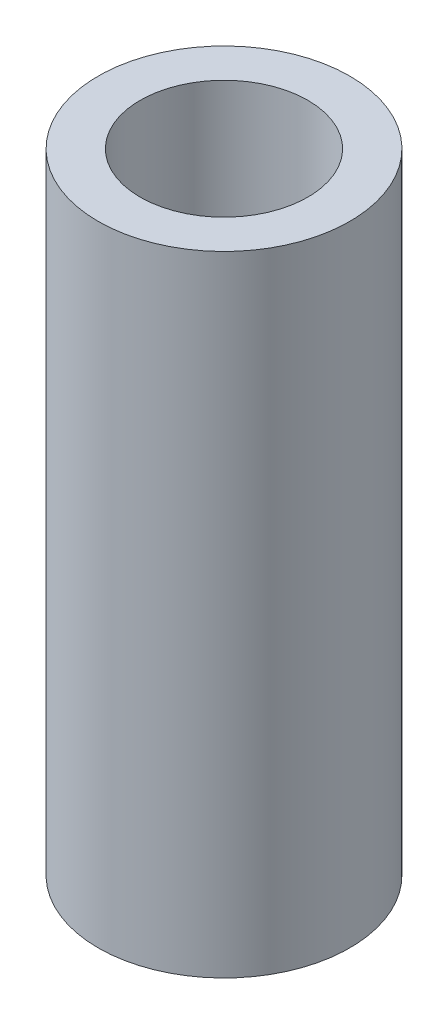
ISO-10303-21;
HEADER;
FILE_DESCRIPTION(('STEP AP214'),'2;1');
FILE_NAME('part.step','',(''),(''),'','','');
FILE_SCHEMA(('AUTOMOTIVE_DESIGN { 1 0 10303 214 1 1 1 1 }'));
ENDSEC;
DATA;
#1=APPLICATION_CONTEXT('core data for automotive mechanical design processes');
#2=APPLICATION_PROTOCOL_DEFINITION('international standard','automotive_design',2000,#1);
#3=PRODUCT_CONTEXT('',#1,'mechanical');
#4=PRODUCT('Part','Part','',(#3));
#5=PRODUCT_RELATED_PRODUCT_CATEGORY('part','',(#4));
#6=PRODUCT_DEFINITION_FORMATION('','',#4);
#7=PRODUCT_DEFINITION_CONTEXT('part definition',#1,'design');
#8=PRODUCT_DEFINITION('design','',#6,#7);
#9=PRODUCT_DEFINITION_SHAPE('','',#8);
#10=(LENGTH_UNIT() NAMED_UNIT(*) SI_UNIT(.MILLI.,.METRE.));
#11=(NAMED_UNIT(*) PLANE_ANGLE_UNIT() SI_UNIT($,.RADIAN.));
#12=(NAMED_UNIT(*) SI_UNIT($,.STERADIAN.) SOLID_ANGLE_UNIT());
#13=UNCERTAINTY_MEASURE_WITH_UNIT(LENGTH_MEASURE(1.E-05),#10,'distance_accuracy_value','');
#14=(GEOMETRIC_REPRESENTATION_CONTEXT(3) GLOBAL_UNCERTAINTY_ASSIGNED_CONTEXT((#13)) GLOBAL_UNIT_ASSIGNED_CONTEXT((#10,
#11,#12)) REPRESENTATION_CONTEXT('',''));
#15=CARTESIAN_POINT('',(0.,0.,0.));
#16=DIRECTION('',(0.,0.,1.));
#17=DIRECTION('',(1.,0.,0.));
#18=AXIS2_PLACEMENT_3D('',#15,#16,#17);
#19=CARTESIAN_POINT('',(0.,30.,0.));
#20=DIRECTION('',(0.,-1.,0.));
#21=DIRECTION('',(0.,0.,-1.));
#22=AXIS2_PLACEMENT_3D('',#19,#20,#21);
#23=CYLINDRICAL_SURFACE('',#22,6.);
#24=CARTESIAN_POINT('',(0.,30.,0.));
#25=DIRECTION('',(0.,1.,0.));
#26=DIRECTION('',(0.,0.,1.));
#27=AXIS2_PLACEMENT_3D('',#24,#25,#26);
#28=CIRCLE('',#27,6.);
#29=CARTESIAN_POINT('',(0.,30.,6.));
#30=VERTEX_POINT('',#29);
#31=EDGE_CURVE('E10',#30,#30,#28,.T.);
#32=ORIENTED_EDGE('',*,*,#31,.F.);
#33=EDGE_LOOP('',(#32));
#34=FACE_BOUND('',#33,.T.);
#35=CARTESIAN_POINT('',(0.,0.,0.));
#36=DIRECTION('',(0.,1.,0.));
#37=DIRECTION('',(0.,0.,1.));
#38=AXIS2_PLACEMENT_3D('',#35,#36,#37);
#39=CIRCLE('',#38,6.);
#40=CARTESIAN_POINT('',(0.,0.,6.));
#41=VERTEX_POINT('',#40);
#42=EDGE_CURVE('E34',#41,#41,#39,.T.);
#43=ORIENTED_EDGE('',*,*,#42,.T.);
#44=EDGE_LOOP('',(#43));
#45=FACE_BOUND('',#44,.T.);
#46=ADVANCED_FACE('F31',(#34,#45),#23,.T.);
#47=CARTESIAN_POINT('',(0.,30.,0.));
#48=DIRECTION('',(0.,1.,0.));
#49=DIRECTION('',(0.,0.,1.));
#50=AXIS2_PLACEMENT_3D('',#47,#48,#49);
#51=PLANE('',#50);
#52=CARTESIAN_POINT('',(0.,30.,0.));
#53=DIRECTION('',(0.,1.,0.));
#54=DIRECTION('',(0.,0.,1.));
#55=AXIS2_PLACEMENT_3D('',#52,#53,#54);
#56=CIRCLE('',#55,4.);
#57=CARTESIAN_POINT('',(0.,30.,4.));
#58=VERTEX_POINT('',#57);
#59=EDGE_CURVE('E43',#58,#58,#56,.T.);
#60=ORIENTED_EDGE('',*,*,#59,.F.);
#61=EDGE_LOOP('',(#60));
#62=FACE_BOUND('',#61,.T.);
#63=ORIENTED_EDGE('',*,*,#31,.T.);
#64=EDGE_LOOP('',(#63));
#65=FACE_BOUND('',#64,.T.);
#66=ADVANCED_FACE('F68',(#62,#65),#51,.T.);
#67=CARTESIAN_POINT('',(0.,0.,0.));
#68=DIRECTION('',(0.,1.,0.));
#69=DIRECTION('',(0.,0.,1.));
#70=AXIS2_PLACEMENT_3D('',#67,#68,#69);
#71=PLANE('',#70);
#72=CARTESIAN_POINT('',(0.,0.,0.));
#73=DIRECTION('',(0.,-1.,0.));
#74=DIRECTION('',(0.,0.,-1.));
#75=AXIS2_PLACEMENT_3D('',#72,#73,#74);
#76=CIRCLE('',#75,3.);
#77=CARTESIAN_POINT('',(0.,0.,-3.));
#78=VERTEX_POINT('',#77);
#79=EDGE_CURVE('E49',#78,#78,#76,.T.);
#80=ORIENTED_EDGE('',*,*,#79,.F.);
#81=EDGE_LOOP('',(#80));
#82=FACE_BOUND('',#81,.T.);
#83=ORIENTED_EDGE('',*,*,#42,.F.);
#84=EDGE_LOOP('',(#83));
#85=FACE_BOUND('',#84,.T.);
#86=ADVANCED_FACE('F64',(#82,#85),#71,.F.);
#87=CARTESIAN_POINT('',(0.,20.,0.));
#88=DIRECTION('',(0.,1.,0.));
#89=DIRECTION('',(0.,0.,1.));
#90=AXIS2_PLACEMENT_3D('',#87,#88,#89);
#91=CYLINDRICAL_SURFACE('',#90,4.);
#92=CARTESIAN_POINT('',(0.,20.,0.));
#93=DIRECTION('',(0.,1.,0.));
#94=DIRECTION('',(0.,0.,1.));
#95=AXIS2_PLACEMENT_3D('',#92,#93,#94);
#96=CIRCLE('',#95,4.);
#97=CARTESIAN_POINT('',(0.,20.,4.));
#98=VERTEX_POINT('',#97);
#99=EDGE_CURVE('E41',#98,#98,#96,.T.);
#100=ORIENTED_EDGE('',*,*,#99,.F.);
#101=EDGE_LOOP('',(#100));
#102=FACE_BOUND('',#101,.T.);
#103=ORIENTED_EDGE('',*,*,#59,.T.);
#104=EDGE_LOOP('',(#103));
#105=FACE_BOUND('',#104,.T.);
#106=ADVANCED_FACE('F67',(#102,#105),#91,.F.);
#107=CARTESIAN_POINT('',(0.,20.,0.));
#108=DIRECTION('',(0.,1.,0.));
#109=DIRECTION('',(0.,0.,1.));
#110=AXIS2_PLACEMENT_3D('',#107,#108,#109);
#111=PLANE('',#110);
#112=ORIENTED_EDGE('',*,*,#99,.T.);
#113=EDGE_LOOP('',(#112));
#114=FACE_BOUND('',#113,.T.);
#115=ADVANCED_FACE('F60',(#114),#111,.T.);
#116=CARTESIAN_POINT('',(0.,10.,0.));
#117=DIRECTION('',(0.,-1.,0.));
#118=DIRECTION('',(0.,0.,-1.));
#119=AXIS2_PLACEMENT_3D('',#116,#117,#118);
#120=CYLINDRICAL_SURFACE('',#119,3.);
#121=CARTESIAN_POINT('',(0.,10.,0.));
#122=DIRECTION('',(0.,-1.,0.));
#123=DIRECTION('',(0.,0.,-1.));
#124=AXIS2_PLACEMENT_3D('',#121,#122,#123);
#125=CIRCLE('',#124,3.);
#126=CARTESIAN_POINT('',(0.,10.,-3.));
#127=VERTEX_POINT('',#126);
#128=EDGE_CURVE('E46',#127,#127,#125,.T.);
#129=ORIENTED_EDGE('',*,*,#128,.F.);
#130=EDGE_LOOP('',(#129));
#131=FACE_BOUND('',#130,.T.);
#132=ORIENTED_EDGE('',*,*,#79,.T.);
#133=EDGE_LOOP('',(#132));
#134=FACE_BOUND('',#133,.T.);
#135=ADVANCED_FACE('F57',(#131,#134),#120,.F.);
#136=CARTESIAN_POINT('',(0.,10.,0.));
#137=DIRECTION('',(0.,-1.,0.));
#138=DIRECTION('',(0.,0.,-1.));
#139=AXIS2_PLACEMENT_3D('',#136,#137,#138);
#140=PLANE('',#139);
#141=ORIENTED_EDGE('',*,*,#128,.T.);
#142=EDGE_LOOP('',(#141));
#143=FACE_BOUND('',#142,.T.);
#144=ADVANCED_FACE('F55',(#143),#140,.T.);
#145=CLOSED_SHELL('',(#46,#66,#86,#106,#115,#135,#144));
#146=MANIFOLD_SOLID_BREP('B2',#145);
#147=ADVANCED_BREP_SHAPE_REPRESENTATION('',(#18,#146),#14);
#148=SHAPE_DEFINITION_REPRESENTATION(#9,#147);
ENDSEC;
END-ISO-10303-21;
